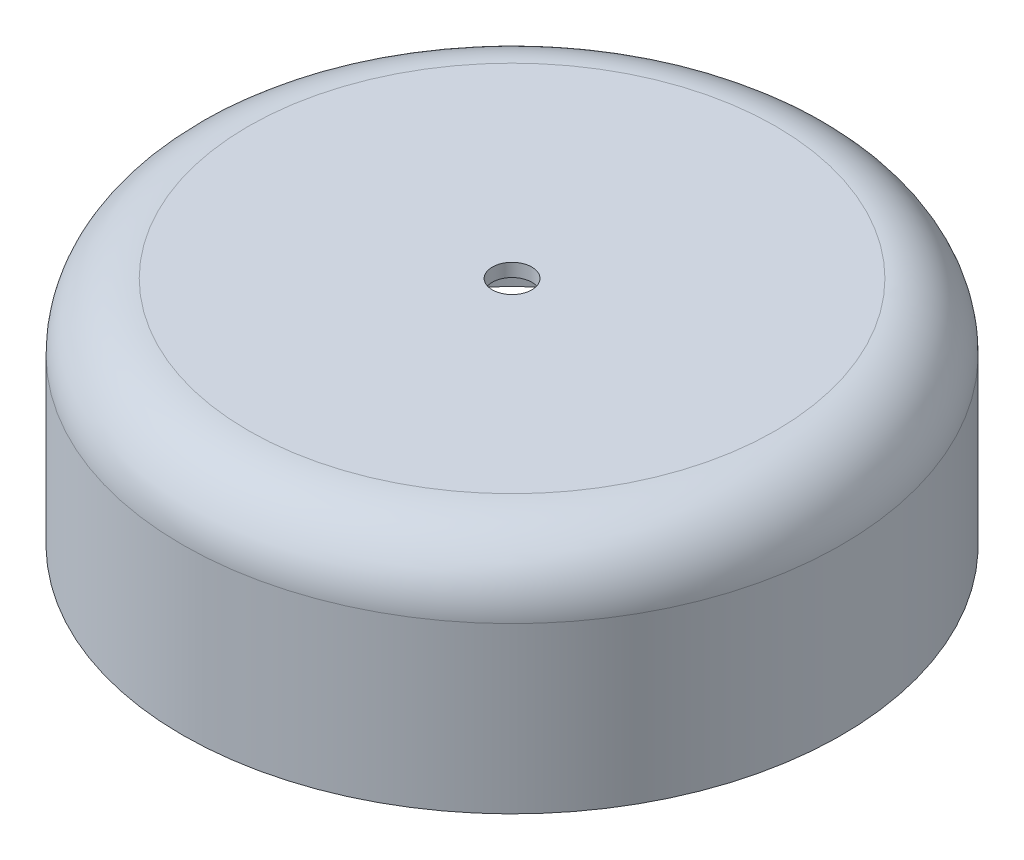
ISO-10303-21;
HEADER;
FILE_DESCRIPTION(('STEP AP214'),'2;1');
FILE_NAME('part.step','',(''),(''),'','','');
FILE_SCHEMA(('AUTOMOTIVE_DESIGN { 1 0 10303 214 1 1 1 1 }'));
ENDSEC;
DATA;
#1=APPLICATION_CONTEXT('core data for automotive mechanical design processes');
#2=APPLICATION_PROTOCOL_DEFINITION('international standard','automotive_design',2000,#1);
#3=PRODUCT_CONTEXT('',#1,'mechanical');
#4=PRODUCT('Part','Part','',(#3));
#5=PRODUCT_RELATED_PRODUCT_CATEGORY('part','',(#4));
#6=PRODUCT_DEFINITION_FORMATION('','',#4);
#7=PRODUCT_DEFINITION_CONTEXT('part definition',#1,'design');
#8=PRODUCT_DEFINITION('design','',#6,#7);
#9=PRODUCT_DEFINITION_SHAPE('','',#8);
#10=(LENGTH_UNIT() NAMED_UNIT(*) SI_UNIT(.MILLI.,.METRE.));
#11=(NAMED_UNIT(*) PLANE_ANGLE_UNIT() SI_UNIT($,.RADIAN.));
#12=(NAMED_UNIT(*) SI_UNIT($,.STERADIAN.) SOLID_ANGLE_UNIT());
#13=UNCERTAINTY_MEASURE_WITH_UNIT(LENGTH_MEASURE(1.E-05),#10,'distance_accuracy_value','');
#14=(GEOMETRIC_REPRESENTATION_CONTEXT(3) GLOBAL_UNCERTAINTY_ASSIGNED_CONTEXT((#13)) GLOBAL_UNIT_ASSIGNED_CONTEXT((#10,
#11,#12)) REPRESENTATION_CONTEXT('',''));
#15=CARTESIAN_POINT('',(0.,0.,0.));
#16=DIRECTION('',(0.,0.,1.));
#17=DIRECTION('',(1.,0.,0.));
#18=AXIS2_PLACEMENT_3D('',#15,#16,#17);
#19=CARTESIAN_POINT('',(0.,33.,0.));
#20=DIRECTION('',(0.,1.,0.));
#21=DIRECTION('',(0.,0.,1.));
#22=AXIS2_PLACEMENT_3D('',#19,#20,#21);
#23=PLANE('',#22);
#24=CARTESIAN_POINT('',(0.,33.,0.));
#25=DIRECTION('',(0.,1.,0.));
#26=DIRECTION('',(0.,0.,1.));
#27=AXIS2_PLACEMENT_3D('',#24,#25,#26);
#28=CIRCLE('',#27,3.);
#29=CARTESIAN_POINT('',(0.,33.,3.));
#30=VERTEX_POINT('',#29);
#31=EDGE_CURVE('E219',#30,#30,#28,.T.);
#32=ORIENTED_EDGE('',*,*,#31,.T.);
#33=EDGE_LOOP('',(#32));
#34=FACE_BOUND('',#33,.T.);
#35=DIRECTION('',(0.,0.,1.));
#36=VECTOR('',#35,1.);
#37=CARTESIAN_POINT('',(6.,33.,10.5));
#38=LINE('',#37,#36);
#39=CARTESIAN_POINT('',(6.,33.,6.));
#40=VERTEX_POINT('',#39);
#41=CARTESIAN_POINT('',(6.,33.,10.5));
#42=VERTEX_POINT('',#41);
#43=EDGE_CURVE('E104',#40,#42,#38,.T.);
#44=ORIENTED_EDGE('',*,*,#43,.F.);
#45=DIRECTION('',(1.,0.,0.));
#46=VECTOR('',#45,1.);
#47=CARTESIAN_POINT('',(-6.,33.,6.));
#48=LINE('',#47,#46);
#49=CARTESIAN_POINT('',(-6.,33.,6.));
#50=VERTEX_POINT('',#49);
#51=EDGE_CURVE('E137',#50,#40,#48,.T.);
#52=ORIENTED_EDGE('',*,*,#51,.F.);
#53=DIRECTION('',(0.,0.,-1.));
#54=VECTOR('',#53,1.);
#55=CARTESIAN_POINT('',(-5.99999999999999,33.,10.5));
#56=LINE('',#55,#54);
#57=CARTESIAN_POINT('',(-5.99999999999999,33.,10.5));
#58=VERTEX_POINT('',#57);
#59=EDGE_CURVE('E149',#58,#50,#56,.T.);
#60=ORIENTED_EDGE('',*,*,#59,.F.);
#61=DIRECTION('',(-1.,0.,0.));
#62=VECTOR('',#61,1.);
#63=CARTESIAN_POINT('',(-5.99999999999999,33.,10.5));
#64=LINE('',#63,#62);
#65=EDGE_CURVE('E146',#42,#58,#64,.T.);
#66=ORIENTED_EDGE('',*,*,#65,.F.);
#67=EDGE_LOOP('',(#44,#52,#60,#66));
#68=FACE_BOUND('',#67,.T.);
#69=CARTESIAN_POINT('',(0.,33.,0.));
#70=DIRECTION('',(0.,1.,0.));
#71=DIRECTION('',(0.,0.,1.));
#72=AXIS2_PLACEMENT_3D('',#69,#70,#71);
#73=CIRCLE('',#72,40.);
#74=CARTESIAN_POINT('',(0.,33.,40.));
#75=VERTEX_POINT('',#74);
#76=EDGE_CURVE('E170',#75,#75,#73,.T.);
#77=ORIENTED_EDGE('',*,*,#76,.F.);
#78=EDGE_LOOP('',(#77));
#79=FACE_BOUND('',#78,.T.);
#80=DIRECTION('',(0.,0.,1.));
#81=VECTOR('',#80,1.);
#82=CARTESIAN_POINT('',(6.00000000000001,33.,-17.));
#83=LINE('',#82,#81);
#84=CARTESIAN_POINT('',(6.00000000000001,33.,-21.5));
#85=VERTEX_POINT('',#84);
#86=CARTESIAN_POINT('',(6.00000000000001,33.,-17.));
#87=VERTEX_POINT('',#86);
#88=EDGE_CURVE('E98',#85,#87,#83,.T.);
#89=ORIENTED_EDGE('',*,*,#88,.F.);
#90=DIRECTION('',(1.,0.,0.));
#91=VECTOR('',#90,1.);
#92=CARTESIAN_POINT('',(-5.99999999999999,33.,-21.5));
#93=LINE('',#92,#91);
#94=CARTESIAN_POINT('',(-5.99999999999999,33.,-21.5));
#95=VERTEX_POINT('',#94);
#96=EDGE_CURVE('E100',#95,#85,#93,.T.);
#97=ORIENTED_EDGE('',*,*,#96,.F.);
#98=DIRECTION('',(0.,0.,-1.));
#99=VECTOR('',#98,1.);
#100=CARTESIAN_POINT('',(-5.99999999999999,33.,-17.));
#101=LINE('',#100,#99);
#102=CARTESIAN_POINT('',(-5.99999999999999,33.,-17.));
#103=VERTEX_POINT('',#102);
#104=EDGE_CURVE('E57',#103,#95,#101,.T.);
#105=ORIENTED_EDGE('',*,*,#104,.F.);
#106=DIRECTION('',(-1.,0.,0.));
#107=VECTOR('',#106,1.);
#108=CARTESIAN_POINT('',(-5.99999999999999,33.,-17.));
#109=LINE('',#108,#107);
#110=EDGE_CURVE('E52',#87,#103,#109,.T.);
#111=ORIENTED_EDGE('',*,*,#110,.F.);
#112=EDGE_LOOP('',(#89,#97,#105,#111));
#113=FACE_BOUND('',#112,.T.);
#114=ADVANCED_FACE('F37',(#34,#68,#79,#113),#23,.F.);
#115=CARTESIAN_POINT('',(0.,35.,0.));
#116=DIRECTION('',(0.,-1.,0.));
#117=DIRECTION('',(0.,0.,-1.));
#118=AXIS2_PLACEMENT_3D('',#115,#116,#117);
#119=CYLINDRICAL_SURFACE('',#118,50.);
#120=CARTESIAN_POINT('',(0.,25.,0.));
#121=DIRECTION('',(0.,1.,0.));
#122=DIRECTION('',(0.,0.,1.));
#123=AXIS2_PLACEMENT_3D('',#120,#121,#122);
#124=CIRCLE('',#123,50.);
#125=CARTESIAN_POINT('',(0.,25.,50.));
#126=VERTEX_POINT('',#125);
#127=EDGE_CURVE('E11',#126,#126,#124,.F.);
#128=ORIENTED_EDGE('',*,*,#127,.T.);
#129=EDGE_LOOP('',(#128));
#130=FACE_BOUND('',#129,.T.);
#131=CARTESIAN_POINT('',(0.,0.,0.));
#132=DIRECTION('',(0.,1.,0.));
#133=DIRECTION('',(0.,0.,1.));
#134=AXIS2_PLACEMENT_3D('',#131,#132,#133);
#135=CIRCLE('',#134,50.);
#136=CARTESIAN_POINT('',(0.,0.,50.));
#137=VERTEX_POINT('',#136);
#138=EDGE_CURVE('E169',#137,#137,#135,.T.);
#139=ORIENTED_EDGE('',*,*,#138,.T.);
#140=EDGE_LOOP('',(#139));
#141=FACE_BOUND('',#140,.T.);
#142=ADVANCED_FACE('F196',(#130,#141),#119,.T.);
#143=CARTESIAN_POINT('',(0.,35.,0.));
#144=DIRECTION('',(0.,1.,0.));
#145=DIRECTION('',(0.,0.,1.));
#146=AXIS2_PLACEMENT_3D('',#143,#144,#145);
#147=PLANE('',#146);
#148=CARTESIAN_POINT('',(0.,35.,0.));
#149=DIRECTION('',(0.,1.,0.));
#150=DIRECTION('',(0.,0.,1.));
#151=AXIS2_PLACEMENT_3D('',#148,#149,#150);
#152=CIRCLE('',#151,3.);
#153=CARTESIAN_POINT('',(0.,35.,3.));
#154=VERTEX_POINT('',#153);
#155=EDGE_CURVE('E217',#154,#154,#152,.T.);
#156=ORIENTED_EDGE('',*,*,#155,.F.);
#157=EDGE_LOOP('',(#156));
#158=FACE_BOUND('',#157,.T.);
#159=CARTESIAN_POINT('',(0.,35.,0.));
#160=DIRECTION('',(0.,1.,0.));
#161=DIRECTION('',(0.,0.,1.));
#162=AXIS2_PLACEMENT_3D('',#159,#160,#161);
#163=CIRCLE('',#162,40.);
#164=CARTESIAN_POINT('',(0.,35.,40.));
#165=VERTEX_POINT('',#164);
#166=EDGE_CURVE('E45',#165,#165,#163,.T.);
#167=ORIENTED_EDGE('',*,*,#166,.T.);
#168=EDGE_LOOP('',(#167));
#169=FACE_BOUND('',#168,.T.);
#170=ADVANCED_FACE('F179',(#158,#169),#147,.T.);
#171=CARTESIAN_POINT('',(0.,0.,0.));
#172=DIRECTION('',(0.,1.,0.));
#173=DIRECTION('',(0.,0.,1.));
#174=AXIS2_PLACEMENT_3D('',#171,#172,#173);
#175=PLANE('',#174);
#176=CARTESIAN_POINT('',(0.,0.,0.));
#177=DIRECTION('',(0.,1.,0.));
#178=DIRECTION('',(0.,0.,1.));
#179=AXIS2_PLACEMENT_3D('',#176,#177,#178);
#180=CIRCLE('',#179,48.);
#181=CARTESIAN_POINT('',(0.,0.,48.));
#182=VERTEX_POINT('',#181);
#183=EDGE_CURVE('E165',#182,#182,#180,.T.);
#184=ORIENTED_EDGE('',*,*,#183,.T.);
#185=EDGE_LOOP('',(#184));
#186=FACE_BOUND('',#185,.T.);
#187=ORIENTED_EDGE('',*,*,#138,.F.);
#188=EDGE_LOOP('',(#187));
#189=FACE_BOUND('',#188,.T.);
#190=ADVANCED_FACE('F183',(#186,#189),#175,.F.);
#191=CARTESIAN_POINT('',(0.,25.,0.));
#192=DIRECTION('',(0.,1.,0.));
#193=DIRECTION('',(0.,0.,1.));
#194=AXIS2_PLACEMENT_3D('',#191,#192,#193);
#195=TOROIDAL_SURFACE('',#194,40.,10.);
#196=ORIENTED_EDGE('',*,*,#127,.F.);
#197=EDGE_LOOP('',(#196));
#198=FACE_BOUND('',#197,.T.);
#199=ORIENTED_EDGE('',*,*,#166,.F.);
#200=EDGE_LOOP('',(#199));
#201=FACE_BOUND('',#200,.T.);
#202=ADVANCED_FACE('F39',(#198,#201),#195,.T.);
#203=CARTESIAN_POINT('',(0.,35.,0.));
#204=DIRECTION('',(0.,-1.,0.));
#205=DIRECTION('',(0.,0.,-1.));
#206=AXIS2_PLACEMENT_3D('',#203,#204,#205);
#207=CYLINDRICAL_SURFACE('',#206,48.);
#208=CARTESIAN_POINT('',(0.,25.,0.));
#209=DIRECTION('',(0.,-1.,0.));
#210=DIRECTION('',(0.,0.,-1.));
#211=AXIS2_PLACEMENT_3D('',#208,#209,#210);
#212=CIRCLE('',#211,48.);
#213=CARTESIAN_POINT('',(0.,25.,-48.));
#214=VERTEX_POINT('',#213);
#215=EDGE_CURVE('E166',#214,#214,#212,.T.);
#216=ORIENTED_EDGE('',*,*,#215,.F.);
#217=EDGE_LOOP('',(#216));
#218=FACE_BOUND('',#217,.T.);
#219=ORIENTED_EDGE('',*,*,#183,.F.);
#220=EDGE_LOOP('',(#219));
#221=FACE_BOUND('',#220,.T.);
#222=ADVANCED_FACE('F182',(#218,#221),#207,.F.);
#223=CARTESIAN_POINT('',(0.,25.,0.));
#224=DIRECTION('',(0.,1.,0.));
#225=DIRECTION('',(0.,0.,1.));
#226=AXIS2_PLACEMENT_3D('',#223,#224,#225);
#227=TOROIDAL_SURFACE('',#226,40.,8.);
#228=ORIENTED_EDGE('',*,*,#215,.T.);
#229=EDGE_LOOP('',(#228));
#230=FACE_BOUND('',#229,.T.);
#231=ORIENTED_EDGE('',*,*,#76,.T.);
#232=EDGE_LOOP('',(#231));
#233=FACE_BOUND('',#232,.T.);
#234=ADVANCED_FACE('F189',(#230,#233),#227,.F.);
#235=CARTESIAN_POINT('',(6.,26.5,10.5));
#236=DIRECTION('',(-1.,0.,0.));
#237=DIRECTION('',(0.,0.,1.));
#238=AXIS2_PLACEMENT_3D('',#235,#236,#237);
#239=PLANE('',#238);
#240=ORIENTED_EDGE('',*,*,#43,.T.);
#241=DIRECTION('',(0.,1.,0.));
#242=VECTOR('',#241,1.);
#243=CARTESIAN_POINT('',(6.,26.5,10.5));
#244=LINE('',#243,#242);
#245=CARTESIAN_POINT('',(6.,26.5,10.5));
#246=VERTEX_POINT('',#245);
#247=EDGE_CURVE('E162',#246,#42,#244,.T.);
#248=ORIENTED_EDGE('',*,*,#247,.F.);
#249=DIRECTION('',(0.,0.,1.));
#250=VECTOR('',#249,1.);
#251=CARTESIAN_POINT('',(6.,26.5,10.5));
#252=LINE('',#251,#250);
#253=CARTESIAN_POINT('',(6.,26.5,6.));
#254=VERTEX_POINT('',#253);
#255=EDGE_CURVE('E133',#254,#246,#252,.T.);
#256=ORIENTED_EDGE('',*,*,#255,.F.);
#257=DIRECTION('',(0.,1.,0.));
#258=VECTOR('',#257,1.);
#259=CARTESIAN_POINT('',(6.,26.5,6.));
#260=LINE('',#259,#258);
#261=EDGE_CURVE('E143',#254,#40,#260,.T.);
#262=ORIENTED_EDGE('',*,*,#261,.T.);
#263=EDGE_LOOP('',(#240,#248,#256,#262));
#264=FACE_BOUND('',#263,.T.);
#265=ADVANCED_FACE('F209',(#264),#239,.F.);
#266=CARTESIAN_POINT('',(-5.99999999999999,26.5,10.5));
#267=DIRECTION('',(0.,0.,-1.));
#268=DIRECTION('',(-1.,0.,0.));
#269=AXIS2_PLACEMENT_3D('',#266,#267,#268);
#270=PLANE('',#269);
#271=ORIENTED_EDGE('',*,*,#65,.T.);
#272=DIRECTION('',(0.,1.,0.));
#273=VECTOR('',#272,1.);
#274=CARTESIAN_POINT('',(-5.99999999999999,26.5,10.5));
#275=LINE('',#274,#273);
#276=CARTESIAN_POINT('',(-5.99999999999999,26.5,10.5));
#277=VERTEX_POINT('',#276);
#278=EDGE_CURVE('E159',#277,#58,#275,.T.);
#279=ORIENTED_EDGE('',*,*,#278,.F.);
#280=DIRECTION('',(-1.,0.,0.));
#281=VECTOR('',#280,1.);
#282=CARTESIAN_POINT('',(-5.99999999999999,26.5,10.5));
#283=LINE('',#282,#281);
#284=EDGE_CURVE('E136',#246,#277,#283,.T.);
#285=ORIENTED_EDGE('',*,*,#284,.F.);
#286=ORIENTED_EDGE('',*,*,#247,.T.);
#287=EDGE_LOOP('',(#271,#279,#285,#286));
#288=FACE_BOUND('',#287,.T.);
#289=ADVANCED_FACE('F255',(#288),#270,.F.);
#290=CARTESIAN_POINT('',(-5.99999999999999,26.5,10.5));
#291=DIRECTION('',(1.,0.,0.));
#292=DIRECTION('',(0.,0.,-1.));
#293=AXIS2_PLACEMENT_3D('',#290,#291,#292);
#294=PLANE('',#293);
#295=ORIENTED_EDGE('',*,*,#59,.T.);
#296=DIRECTION('',(0.,1.,0.));
#297=VECTOR('',#296,1.);
#298=CARTESIAN_POINT('',(-6.,26.5,6.));
#299=LINE('',#298,#297);
#300=CARTESIAN_POINT('',(-6.,26.5,6.));
#301=VERTEX_POINT('',#300);
#302=EDGE_CURVE('E156',#301,#50,#299,.T.);
#303=ORIENTED_EDGE('',*,*,#302,.F.);
#304=DIRECTION('',(0.,0.,-1.));
#305=VECTOR('',#304,1.);
#306=CARTESIAN_POINT('',(-5.99999999999999,26.5,10.5));
#307=LINE('',#306,#305);
#308=EDGE_CURVE('E139',#277,#301,#307,.T.);
#309=ORIENTED_EDGE('',*,*,#308,.F.);
#310=ORIENTED_EDGE('',*,*,#278,.T.);
#311=EDGE_LOOP('',(#295,#303,#309,#310));
#312=FACE_BOUND('',#311,.T.);
#313=ADVANCED_FACE('F251',(#312),#294,.F.);
#314=CARTESIAN_POINT('',(-6.,26.5,6.));
#315=DIRECTION('',(0.,0.,1.));
#316=DIRECTION('',(1.,0.,0.));
#317=AXIS2_PLACEMENT_3D('',#314,#315,#316);
#318=PLANE('',#317);
#319=ORIENTED_EDGE('',*,*,#51,.T.);
#320=ORIENTED_EDGE('',*,*,#261,.F.);
#321=DIRECTION('',(1.,0.,0.));
#322=VECTOR('',#321,1.);
#323=CARTESIAN_POINT('',(-6.,26.5,6.));
#324=LINE('',#323,#322);
#325=EDGE_CURVE('E141',#301,#254,#324,.T.);
#326=ORIENTED_EDGE('',*,*,#325,.F.);
#327=ORIENTED_EDGE('',*,*,#302,.T.);
#328=EDGE_LOOP('',(#319,#320,#326,#327));
#329=FACE_BOUND('',#328,.T.);
#330=ADVANCED_FACE('F247',(#329),#318,.F.);
#331=CARTESIAN_POINT('',(0.,26.5,0.));
#332=DIRECTION('',(0.,-1.,0.));
#333=DIRECTION('',(0.,0.,-1.));
#334=AXIS2_PLACEMENT_3D('',#331,#332,#333);
#335=PLANE('',#334);
#336=ORIENTED_EDGE('',*,*,#255,.T.);
#337=ORIENTED_EDGE('',*,*,#284,.T.);
#338=ORIENTED_EDGE('',*,*,#308,.T.);
#339=ORIENTED_EDGE('',*,*,#325,.T.);
#340=EDGE_LOOP('',(#336,#337,#338,#339));
#341=FACE_BOUND('',#340,.T.);
#342=ADVANCED_FACE('F244',(#341),#335,.T.);
#343=CARTESIAN_POINT('',(6.00000000000001,26.5,-17.));
#344=DIRECTION('',(-1.,0.,0.));
#345=DIRECTION('',(0.,0.,1.));
#346=AXIS2_PLACEMENT_3D('',#343,#344,#345);
#347=PLANE('',#346);
#348=ORIENTED_EDGE('',*,*,#88,.T.);
#349=DIRECTION('',(0.,1.,0.));
#350=VECTOR('',#349,1.);
#351=CARTESIAN_POINT('',(6.00000000000001,26.5,-17.));
#352=LINE('',#351,#350);
#353=CARTESIAN_POINT('',(6.00000000000001,26.5,-17.));
#354=VERTEX_POINT('',#353);
#355=EDGE_CURVE('E221',#354,#87,#352,.T.);
#356=ORIENTED_EDGE('',*,*,#355,.F.);
#357=DIRECTION('',(0.,0.,1.));
#358=VECTOR('',#357,1.);
#359=CARTESIAN_POINT('',(6.00000000000001,26.5,-17.));
#360=LINE('',#359,#358);
#361=CARTESIAN_POINT('',(6.00000000000001,26.5,-21.5));
#362=VERTEX_POINT('',#361);
#363=EDGE_CURVE('E115',#362,#354,#360,.T.);
#364=ORIENTED_EDGE('',*,*,#363,.F.);
#365=DIRECTION('',(0.,1.,0.));
#366=VECTOR('',#365,1.);
#367=CARTESIAN_POINT('',(6.00000000000001,26.5,-21.5));
#368=LINE('',#367,#366);
#369=EDGE_CURVE('E111',#362,#85,#368,.T.);
#370=ORIENTED_EDGE('',*,*,#369,.T.);
#371=EDGE_LOOP('',(#348,#356,#364,#370));
#372=FACE_BOUND('',#371,.T.);
#373=ADVANCED_FACE('F117',(#372),#347,.F.);
#374=CARTESIAN_POINT('',(-5.99999999999999,26.5,-17.));
#375=DIRECTION('',(0.,0.,-1.));
#376=DIRECTION('',(-1.,0.,0.));
#377=AXIS2_PLACEMENT_3D('',#374,#375,#376);
#378=PLANE('',#377);
#379=ORIENTED_EDGE('',*,*,#110,.T.);
#380=DIRECTION('',(0.,1.,0.));
#381=VECTOR('',#380,1.);
#382=CARTESIAN_POINT('',(-5.99999999999999,26.5,-17.));
#383=LINE('',#382,#381);
#384=CARTESIAN_POINT('',(-5.99999999999999,26.5,-17.));
#385=VERTEX_POINT('',#384);
#386=EDGE_CURVE('E123',#385,#103,#383,.T.);
#387=ORIENTED_EDGE('',*,*,#386,.F.);
#388=DIRECTION('',(-1.,0.,0.));
#389=VECTOR('',#388,1.);
#390=CARTESIAN_POINT('',(-5.99999999999999,26.5,-17.));
#391=LINE('',#390,#389);
#392=EDGE_CURVE('E130',#354,#385,#391,.T.);
#393=ORIENTED_EDGE('',*,*,#392,.F.);
#394=ORIENTED_EDGE('',*,*,#355,.T.);
#395=EDGE_LOOP('',(#379,#387,#393,#394));
#396=FACE_BOUND('',#395,.T.);
#397=ADVANCED_FACE('F230',(#396),#378,.F.);
#398=CARTESIAN_POINT('',(-5.99999999999999,26.5,-17.));
#399=DIRECTION('',(1.,0.,0.));
#400=DIRECTION('',(0.,0.,-1.));
#401=AXIS2_PLACEMENT_3D('',#398,#399,#400);
#402=PLANE('',#401);
#403=ORIENTED_EDGE('',*,*,#104,.T.);
#404=DIRECTION('',(0.,1.,0.));
#405=VECTOR('',#404,1.);
#406=CARTESIAN_POINT('',(-5.99999999999999,26.5,-21.5));
#407=LINE('',#406,#405);
#408=CARTESIAN_POINT('',(-5.99999999999999,26.5,-21.5));
#409=VERTEX_POINT('',#408);
#410=EDGE_CURVE('E114',#409,#95,#407,.T.);
#411=ORIENTED_EDGE('',*,*,#410,.F.);
#412=DIRECTION('',(0.,0.,-1.));
#413=VECTOR('',#412,1.);
#414=CARTESIAN_POINT('',(-5.99999999999999,26.5,-17.));
#415=LINE('',#414,#413);
#416=EDGE_CURVE('E121',#385,#409,#415,.T.);
#417=ORIENTED_EDGE('',*,*,#416,.F.);
#418=ORIENTED_EDGE('',*,*,#386,.T.);
#419=EDGE_LOOP('',(#403,#411,#417,#418));
#420=FACE_BOUND('',#419,.T.);
#421=ADVANCED_FACE('F228',(#420),#402,.F.);
#422=CARTESIAN_POINT('',(-5.99999999999999,26.5,-21.5));
#423=DIRECTION('',(0.,0.,1.));
#424=DIRECTION('',(1.,0.,0.));
#425=AXIS2_PLACEMENT_3D('',#422,#423,#424);
#426=PLANE('',#425);
#427=ORIENTED_EDGE('',*,*,#96,.T.);
#428=ORIENTED_EDGE('',*,*,#369,.F.);
#429=DIRECTION('',(1.,0.,0.));
#430=VECTOR('',#429,1.);
#431=CARTESIAN_POINT('',(-5.99999999999999,26.5,-21.5));
#432=LINE('',#431,#430);
#433=EDGE_CURVE('E119',#409,#362,#432,.T.);
#434=ORIENTED_EDGE('',*,*,#433,.F.);
#435=ORIENTED_EDGE('',*,*,#410,.T.);
#436=EDGE_LOOP('',(#427,#428,#434,#435));
#437=FACE_BOUND('',#436,.T.);
#438=ADVANCED_FACE('F109',(#437),#426,.F.);
#439=CARTESIAN_POINT('',(0.,26.5,0.));
#440=DIRECTION('',(0.,-1.,0.));
#441=DIRECTION('',(0.,0.,-1.));
#442=AXIS2_PLACEMENT_3D('',#439,#440,#441);
#443=PLANE('',#442);
#444=ORIENTED_EDGE('',*,*,#363,.T.);
#445=ORIENTED_EDGE('',*,*,#392,.T.);
#446=ORIENTED_EDGE('',*,*,#416,.T.);
#447=ORIENTED_EDGE('',*,*,#433,.T.);
#448=EDGE_LOOP('',(#444,#445,#446,#447));
#449=FACE_BOUND('',#448,.T.);
#450=ADVANCED_FACE('F232',(#449),#443,.T.);
#451=CARTESIAN_POINT('',(0.,28.5,0.));
#452=DIRECTION('',(0.,1.,0.));
#453=DIRECTION('',(0.,0.,1.));
#454=AXIS2_PLACEMENT_3D('',#451,#452,#453);
#455=CYLINDRICAL_SURFACE('',#454,3.);
#456=CARTESIAN_POINT('',(0.,35.,3.));
#457=CARTESIAN_POINT('',(0.,34.9791666666667,3.));
#458=CARTESIAN_POINT('',(0.,34.9583333333333,3.));
#459=CARTESIAN_POINT('',(0.,34.9166666666667,3.));
#460=CARTESIAN_POINT('',(0.,34.8958333333333,3.));
#461=CARTESIAN_POINT('',(0.,34.8541666666667,3.));
#462=CARTESIAN_POINT('',(0.,34.8333333333333,3.));
#463=CARTESIAN_POINT('',(0.,34.7916666666667,3.));
#464=CARTESIAN_POINT('',(0.,34.7708333333333,3.));
#465=CARTESIAN_POINT('',(0.,34.7291666666667,3.));
#466=CARTESIAN_POINT('',(0.,34.7083333333333,3.));
#467=CARTESIAN_POINT('',(0.,34.6666666666667,3.));
#468=CARTESIAN_POINT('',(0.,34.6458333333333,3.));
#469=CARTESIAN_POINT('',(0.,34.6041666666667,3.));
#470=CARTESIAN_POINT('',(0.,34.5833333333333,3.));
#471=CARTESIAN_POINT('',(0.,34.5416666666667,3.));
#472=CARTESIAN_POINT('',(0.,34.5208333333333,3.));
#473=CARTESIAN_POINT('',(0.,34.4791666666667,3.));
#474=CARTESIAN_POINT('',(0.,34.4583333333333,3.));
#475=CARTESIAN_POINT('',(0.,34.4166666666667,3.));
#476=CARTESIAN_POINT('',(0.,34.3958333333333,3.));
#477=CARTESIAN_POINT('',(0.,34.3541666666667,3.));
#478=CARTESIAN_POINT('',(0.,34.3333333333333,3.));
#479=CARTESIAN_POINT('',(0.,34.2916666666667,3.));
#480=CARTESIAN_POINT('',(0.,34.2708333333333,3.));
#481=CARTESIAN_POINT('',(0.,34.2291666666667,3.));
#482=CARTESIAN_POINT('',(0.,34.2083333333333,3.));
#483=CARTESIAN_POINT('',(0.,34.1666666666667,3.));
#484=CARTESIAN_POINT('',(0.,34.1458333333333,3.));
#485=CARTESIAN_POINT('',(0.,34.1041666666667,3.));
#486=CARTESIAN_POINT('',(0.,34.0833333333333,3.));
#487=CARTESIAN_POINT('',(0.,34.0416666666667,3.));
#488=CARTESIAN_POINT('',(0.,34.0208333333333,3.));
#489=CARTESIAN_POINT('',(0.,33.9791666666667,3.));
#490=CARTESIAN_POINT('',(0.,33.9583333333333,3.));
#491=CARTESIAN_POINT('',(0.,33.9166666666667,3.));
#492=CARTESIAN_POINT('',(0.,33.8958333333333,3.));
#493=CARTESIAN_POINT('',(0.,33.8541666666667,3.));
#494=CARTESIAN_POINT('',(0.,33.8333333333333,3.));
#495=CARTESIAN_POINT('',(0.,33.7916666666667,3.));
#496=CARTESIAN_POINT('',(0.,33.7708333333333,3.));
#497=CARTESIAN_POINT('',(0.,33.7291666666667,3.));
#498=CARTESIAN_POINT('',(0.,33.7083333333333,3.));
#499=CARTESIAN_POINT('',(0.,33.6666666666667,3.));
#500=CARTESIAN_POINT('',(0.,33.6458333333333,3.));
#501=CARTESIAN_POINT('',(0.,33.6041666666667,3.));
#502=CARTESIAN_POINT('',(0.,33.5833333333333,3.));
#503=CARTESIAN_POINT('',(0.,33.5416666666667,3.));
#504=CARTESIAN_POINT('',(0.,33.5208333333333,3.));
#505=CARTESIAN_POINT('',(0.,33.4791666666667,3.));
#506=CARTESIAN_POINT('',(0.,33.4583333333333,3.));
#507=CARTESIAN_POINT('',(0.,33.4166666666667,3.));
#508=CARTESIAN_POINT('',(0.,33.3958333333333,3.));
#509=CARTESIAN_POINT('',(0.,33.3541666666667,3.));
#510=CARTESIAN_POINT('',(0.,33.3333333333333,3.));
#511=CARTESIAN_POINT('',(0.,33.2916666666667,3.));
#512=CARTESIAN_POINT('',(0.,33.2708333333333,3.));
#513=CARTESIAN_POINT('',(0.,33.2291666666667,3.));
#514=CARTESIAN_POINT('',(0.,33.2083333333333,3.));
#515=CARTESIAN_POINT('',(0.,33.1666666666667,3.));
#516=CARTESIAN_POINT('',(0.,33.1458333333333,3.));
#517=CARTESIAN_POINT('',(0.,33.1041666666667,3.));
#518=CARTESIAN_POINT('',(0.,33.0833333333333,3.));
#519=CARTESIAN_POINT('',(0.,33.0416666666667,3.));
#520=CARTESIAN_POINT('',(0.,33.0208333333333,3.));
#521=CARTESIAN_POINT('',(0.,33.,3.));
#522=B_SPLINE_CURVE_WITH_KNOTS('',3,(#456,#457,#458,#459,#460,#461,#462,#463,#464,#465,#466,
#467,#468,#469,#470,#471,#472,#473,#474,#475,#476,#477,#478,#479,#480,#481,#482,#483,#484,#485,
#486,#487,#488,#489,#490,#491,#492,#493,#494,#495,#496,#497,#498,#499,#500,#501,#502,#503,#504,
#505,#506,#507,#508,#509,#510,#511,#512,#513,#514,#515,#516,#517,#518,#519,#520,#521),
.UNSPECIFIED.,.F.,.F.,(4,2,2,2,2,2,2,2,2,2,2,2,2,2,2,2,2,2,2,2,2,2,2,2,2,2,2,2,2,2,2,2,4),(0.,
0.0625000000000001,0.125,0.1875,0.25,0.3125,0.375,0.4375,0.5,0.5625,0.625000000000001,
0.687500000000001,0.750000000000001,0.812500000000001,0.875000000000001,0.937500000000001,1.,
1.0625,1.125,1.1875,1.25,1.3125,1.375,1.4375,1.5,1.5625,1.625,1.6875,1.75,1.8125,1.875,1.9375,
2.),.UNSPECIFIED.);
#523=EDGE_CURVE('BSEAM234',#154,#30,#522,.T.);
#524=ORIENTED_EDGE('',*,*,#155,.T.);
#525=ORIENTED_EDGE('',*,*,#31,.F.);
#526=ORIENTED_EDGE('',*,*,#523,.T.);
#527=ORIENTED_EDGE('',*,*,#523,.F.);
#528=EDGE_LOOP('',(#524,#526,#525,#527));
#529=FACE_BOUND('',#528,.T.);
#530=ADVANCED_FACE('F234',(#529),#455,.F.);
#531=CLOSED_SHELL('',(#114,#142,#170,#190,#202,#222,#234,#265,#289,#313,#330,#342,#373,#397,
#421,#438,#450,#530));
#532=MANIFOLD_SOLID_BREP('B2',#531);
#533=ADVANCED_BREP_SHAPE_REPRESENTATION('',(#18,#532),#14);
#534=SHAPE_DEFINITION_REPRESENTATION(#9,#533);
ENDSEC;
END-ISO-10303-21;
